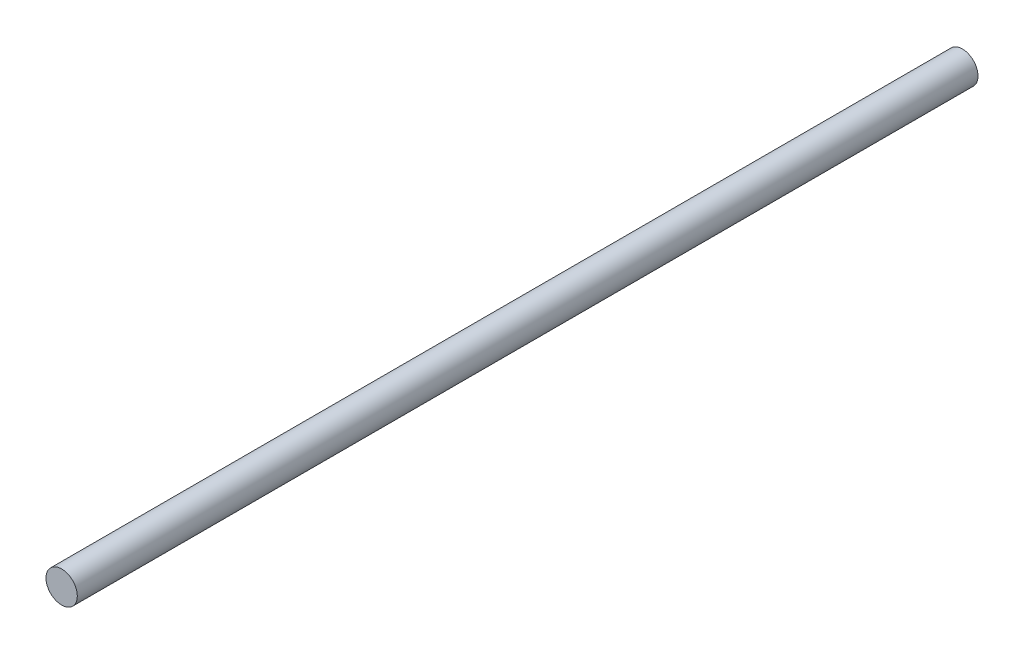
ISO-10303-21;
HEADER;
FILE_DESCRIPTION(('STEP AP214'),'2;1');
FILE_NAME('part.step','',(''),(''),'','','');
FILE_SCHEMA(('AUTOMOTIVE_DESIGN { 1 0 10303 214 1 1 1 1 }'));
ENDSEC;
DATA;
#1=APPLICATION_CONTEXT('core data for automotive mechanical design processes');
#2=APPLICATION_PROTOCOL_DEFINITION('international standard','automotive_design',2000,#1);
#3=PRODUCT_CONTEXT('',#1,'mechanical');
#4=PRODUCT('Part','Part','',(#3));
#5=PRODUCT_RELATED_PRODUCT_CATEGORY('part','',(#4));
#6=PRODUCT_DEFINITION_FORMATION('','',#4);
#7=PRODUCT_DEFINITION_CONTEXT('part definition',#1,'design');
#8=PRODUCT_DEFINITION('design','',#6,#7);
#9=PRODUCT_DEFINITION_SHAPE('','',#8);
#10=(LENGTH_UNIT() NAMED_UNIT(*) SI_UNIT(.MILLI.,.METRE.));
#11=(NAMED_UNIT(*) PLANE_ANGLE_UNIT() SI_UNIT($,.RADIAN.));
#12=(NAMED_UNIT(*) SI_UNIT($,.STERADIAN.) SOLID_ANGLE_UNIT());
#13=UNCERTAINTY_MEASURE_WITH_UNIT(LENGTH_MEASURE(1.E-05),#10,'distance_accuracy_value','');
#14=(GEOMETRIC_REPRESENTATION_CONTEXT(3) GLOBAL_UNCERTAINTY_ASSIGNED_CONTEXT((#13)) GLOBAL_UNIT_ASSIGNED_CONTEXT((#10,
#11,#12)) REPRESENTATION_CONTEXT('',''));
#15=CARTESIAN_POINT('',(0.,0.,0.));
#16=DIRECTION('',(0.,0.,1.));
#17=DIRECTION('',(1.,0.,0.));
#18=AXIS2_PLACEMENT_3D('',#15,#16,#17);
#19=CARTESIAN_POINT('',(-1.746448473165E-13,6.58887378512249E-13,318.));
#20=DIRECTION('',(0.,0.,-1.));
#21=DIRECTION('',(0.,1.,0.));
#22=AXIS2_PLACEMENT_3D('',#19,#20,#21);
#23=CYLINDRICAL_SURFACE('',#22,4.);
#24=CARTESIAN_POINT('',(-1.74644847316499E-13,6.58887378512247E-13,18.));
#25=DIRECTION('',(0.,0.,-1.));
#26=DIRECTION('',(0.,1.,0.));
#27=AXIS2_PLACEMENT_3D('',#24,#25,#26);
#28=CIRCLE('',#27,4.);
#29=CARTESIAN_POINT('',(-1.74644847316499E-13,4.00000000000066,18.));
#30=VERTEX_POINT('',#29);
#31=EDGE_CURVE('E10',#30,#30,#28,.T.);
#32=ORIENTED_EDGE('',*,*,#31,.F.);
#33=EDGE_LOOP('',(#32));
#34=FACE_BOUND('',#33,.T.);
#35=CARTESIAN_POINT('',(-1.746448473165E-13,6.58887378512249E-13,248.));
#36=DIRECTION('',(0.,0.,1.));
#37=DIRECTION('',(1.,0.,0.));
#38=AXIS2_PLACEMENT_3D('',#35,#36,#37);
#39=CIRCLE('',#38,4.);
#40=CARTESIAN_POINT('',(3.99999999999983,6.58887378512249E-13,248.));
#41=VERTEX_POINT('',#40);
#42=EDGE_CURVE('E39',#41,#41,#39,.T.);
#43=ORIENTED_EDGE('',*,*,#42,.F.);
#44=EDGE_LOOP('',(#43));
#45=FACE_BOUND('',#44,.T.);
#46=ADVANCED_FACE('F33',(#34,#45),#23,.T.);
#47=CARTESIAN_POINT('',(-1.74644847316499E-13,6.58887378512247E-13,18.));
#48=DIRECTION('',(0.,0.,-1.));
#49=DIRECTION('',(0.,1.,0.));
#50=AXIS2_PLACEMENT_3D('',#47,#48,#49);
#51=PLANE('',#50);
#52=ORIENTED_EDGE('',*,*,#31,.T.);
#53=EDGE_LOOP('',(#52));
#54=FACE_BOUND('',#53,.T.);
#55=ADVANCED_FACE('F48',(#54),#51,.T.);
#56=CARTESIAN_POINT('',(-1.746448473165E-13,6.58887378512249E-13,248.));
#57=DIRECTION('',(0.,0.,1.));
#58=DIRECTION('',(1.,0.,0.));
#59=AXIS2_PLACEMENT_3D('',#56,#57,#58);
#60=PLANE('',#59);
#61=ORIENTED_EDGE('',*,*,#42,.T.);
#62=EDGE_LOOP('',(#61));
#63=FACE_BOUND('',#62,.T.);
#64=ADVANCED_FACE('F45',(#63),#60,.T.);
#65=CLOSED_SHELL('',(#46,#55,#64));
#66=MANIFOLD_SOLID_BREP('B2',#65);
#67=ADVANCED_BREP_SHAPE_REPRESENTATION('',(#18,#66),#14);
#68=SHAPE_DEFINITION_REPRESENTATION(#9,#67);
ENDSEC;
END-ISO-10303-21;
